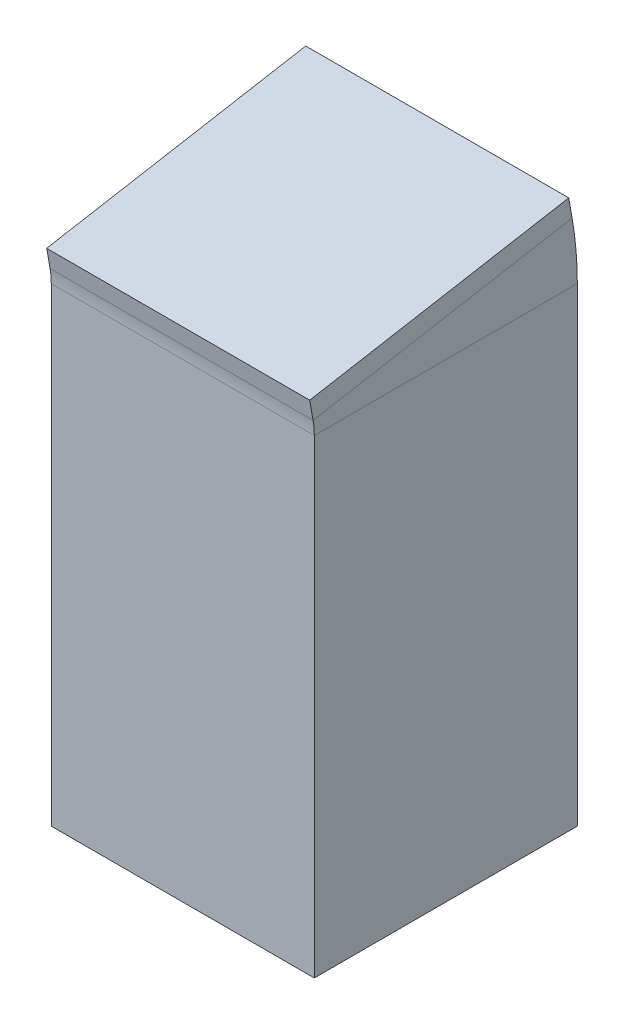
ISO-10303-21;
HEADER;
FILE_DESCRIPTION(('STEP AP214'),'2;1');
FILE_NAME('part.step','',(''),(''),'','','');
FILE_SCHEMA(('AUTOMOTIVE_DESIGN { 1 0 10303 214 1 1 1 1 }'));
ENDSEC;
DATA;
#1=APPLICATION_CONTEXT('core data for automotive mechanical design processes');
#2=APPLICATION_PROTOCOL_DEFINITION('international standard','automotive_design',2000,#1);
#3=PRODUCT_CONTEXT('',#1,'mechanical');
#4=PRODUCT('Part','Part','',(#3));
#5=PRODUCT_RELATED_PRODUCT_CATEGORY('part','',(#4));
#6=PRODUCT_DEFINITION_FORMATION('','',#4);
#7=PRODUCT_DEFINITION_CONTEXT('part definition',#1,'design');
#8=PRODUCT_DEFINITION('design','',#6,#7);
#9=PRODUCT_DEFINITION_SHAPE('','',#8);
#10=(LENGTH_UNIT() NAMED_UNIT(*) SI_UNIT(.MILLI.,.METRE.));
#11=(NAMED_UNIT(*) PLANE_ANGLE_UNIT() SI_UNIT($,.RADIAN.));
#12=(NAMED_UNIT(*) SI_UNIT($,.STERADIAN.) SOLID_ANGLE_UNIT());
#13=UNCERTAINTY_MEASURE_WITH_UNIT(LENGTH_MEASURE(1.E-05),#10,'distance_accuracy_value','');
#14=(GEOMETRIC_REPRESENTATION_CONTEXT(3) GLOBAL_UNCERTAINTY_ASSIGNED_CONTEXT((#13)) GLOBAL_UNIT_ASSIGNED_CONTEXT((#10,
#11,#12)) REPRESENTATION_CONTEXT('',''));
#15=CARTESIAN_POINT('',(0.,0.,0.));
#16=DIRECTION('',(0.,0.,1.));
#17=DIRECTION('',(1.,0.,0.));
#18=AXIS2_PLACEMENT_3D('',#15,#16,#17);
#19=CARTESIAN_POINT('',(0.,-1.48014115800869,-8.37869296850667));
#20=DIRECTION('',(0.,0.173648177666931,-0.984807753012208));
#21=DIRECTION('',(-1.,0.,0.));
#22=AXIS2_PLACEMENT_3D('',#19,#20,#21);
#23=PLANE('',#22);
#24=DIRECTION('',(0.,-0.984807753012208,-0.173648177666931));
#25=VECTOR('',#24,1.);
#26=CARTESIAN_POINT('',(0.,-1.48014115800869,-8.37869296850667));
#27=LINE('',#26,#25);
#28=CARTESIAN_POINT('',(0.,48.5480926950115,0.44263445697341));
#29=VERTEX_POINT('',#28);
#30=CARTESIAN_POINT('',(0.,46.6943234441962,0.11576492204696));
#31=VERTEX_POINT('',#30);
#32=EDGE_CURVE('E59',#29,#31,#27,.T.);
#33=ORIENTED_EDGE('',*,*,#32,.T.);
#34=DIRECTION('',(1.,0.,0.));
#35=VECTOR('',#34,1.);
#36=CARTESIAN_POINT('',(0.,46.6943234441961,0.115764922046945));
#37=LINE('',#36,#35);
#38=CARTESIAN_POINT('',(25.4,46.6943234441962,0.11576492204696));
#39=VERTEX_POINT('',#38);
#40=EDGE_CURVE('E51',#31,#39,#37,.T.);
#41=ORIENTED_EDGE('',*,*,#40,.T.);
#42=DIRECTION('',(0.,0.984807753012208,0.173648177666931));
#43=VECTOR('',#42,1.);
#44=CARTESIAN_POINT('',(25.4,-1.48014115800869,-8.37869296850667));
#45=LINE('',#44,#43);
#46=CARTESIAN_POINT('',(25.4,48.5480926950115,0.44263445697341));
#47=VERTEX_POINT('',#46);
#48=EDGE_CURVE('E67',#39,#47,#45,.T.);
#49=ORIENTED_EDGE('',*,*,#48,.T.);
#50=DIRECTION('',(-1.,0.,0.));
#51=VECTOR('',#50,1.);
#52=CARTESIAN_POINT('',(0.,48.5480926950115,0.44263445697341));
#53=LINE('',#52,#51);
#54=EDGE_CURVE('E169',#47,#29,#53,.T.);
#55=ORIENTED_EDGE('',*,*,#54,.T.);
#56=EDGE_LOOP('',(#33,#41,#49,#55));
#57=FACE_BOUND('',#56,.T.);
#58=ADVANCED_FACE('F42',(#57),#23,.F.);
#59=CARTESIAN_POINT('',(0.,2.93052255473135,-33.3928098950168));
#60=DIRECTION('',(-1.,0.,0.));
#61=DIRECTION('',(0.,-0.173648177666931,0.984807753012208));
#62=AXIS2_PLACEMENT_3D('',#59,#60,#61);
#63=PLANE('',#62);
#64=DIRECTION('',(0.,0.173648177666938,-0.984807753012207));
#65=VECTOR('',#64,1.);
#66=CARTESIAN_POINT('',(0.,51.1049871569363,-24.8983520044628));
#67=LINE('',#66,#65);
#68=CARTESIAN_POINT('',(0.,51.1049871569363,-24.8983520044631));
#69=VERTEX_POINT('',#68);
#70=EDGE_CURVE('E12',#31,#69,#67,.T.);
#71=ORIENTED_EDGE('',*,*,#70,.F.);
#72=ORIENTED_EDGE('',*,*,#32,.F.);
#73=DIRECTION('',(0.,-0.173648177666931,0.984807753012208));
#74=VECTOR('',#73,1.);
#75=CARTESIAN_POINT('',(0.,52.9587564077515,-24.5714824695367));
#76=LINE('',#75,#74);
#77=CARTESIAN_POINT('',(0.,52.9587564077515,-24.5714824695367));
#78=VERTEX_POINT('',#77);
#79=EDGE_CURVE('E172',#78,#29,#76,.T.);
#80=ORIENTED_EDGE('',*,*,#79,.F.);
#81=DIRECTION('',(0.,-0.984807753012208,-0.173648177666931));
#82=VECTOR('',#81,1.);
#83=CARTESIAN_POINT('',(0.,2.93052255473135,-33.3928098950168));
#84=LINE('',#83,#82);
#85=EDGE_CURVE('E171',#78,#69,#84,.T.);
#86=ORIENTED_EDGE('',*,*,#85,.T.);
#87=EDGE_LOOP('',(#71,#72,#80,#86));
#88=FACE_BOUND('',#87,.T.);
#89=ADVANCED_FACE('F44',(#88),#63,.T.);
#90=CARTESIAN_POINT('',(0.,52.9587564077515,-24.5714824695367));
#91=DIRECTION('',(0.,0.984807753012208,0.173648177666931));
#92=DIRECTION('',(0.,-0.173648177666931,0.984807753012208));
#93=AXIS2_PLACEMENT_3D('',#90,#91,#92);
#94=PLANE('',#93);
#95=ORIENTED_EDGE('',*,*,#54,.F.);
#96=DIRECTION('',(0.,-0.173648177666931,0.984807753012208));
#97=VECTOR('',#96,1.);
#98=CARTESIAN_POINT('',(25.4,52.9587564077515,-24.5714824695367));
#99=LINE('',#98,#97);
#100=CARTESIAN_POINT('',(25.4,52.9587564077515,-24.5714824695367));
#101=VERTEX_POINT('',#100);
#102=EDGE_CURVE('E168',#101,#47,#99,.T.);
#103=ORIENTED_EDGE('',*,*,#102,.F.);
#104=DIRECTION('',(-1.,0.,0.));
#105=VECTOR('',#104,1.);
#106=CARTESIAN_POINT('',(0.,52.9587564077515,-24.5714824695367));
#107=LINE('',#106,#105);
#108=EDGE_CURVE('E165',#101,#78,#107,.T.);
#109=ORIENTED_EDGE('',*,*,#108,.T.);
#110=ORIENTED_EDGE('',*,*,#79,.T.);
#111=EDGE_LOOP('',(#95,#103,#109,#110));
#112=FACE_BOUND('',#111,.T.);
#113=ADVANCED_FACE('F217',(#112),#94,.T.);
#114=CARTESIAN_POINT('',(25.4,2.93052255473135,-33.3928098950168));
#115=DIRECTION('',(1.,0.,0.));
#116=DIRECTION('',(0.,0.173648177666931,-0.984807753012208));
#117=AXIS2_PLACEMENT_3D('',#114,#115,#116);
#118=PLANE('',#117);
#119=DIRECTION('',(0.,-0.173648177666938,0.984807753012207));
#120=VECTOR('',#119,1.);
#121=CARTESIAN_POINT('',(25.4,51.1049871569363,-24.8983520044628));
#122=LINE('',#121,#120);
#123=CARTESIAN_POINT('',(25.4,51.1049871569363,-24.8983520044631));
#124=VERTEX_POINT('',#123);
#125=EDGE_CURVE('E177',#124,#39,#122,.T.);
#126=ORIENTED_EDGE('',*,*,#125,.F.);
#127=DIRECTION('',(0.,0.984807753012208,0.173648177666931));
#128=VECTOR('',#127,1.);
#129=CARTESIAN_POINT('',(25.4,2.93052255473135,-33.3928098950168));
#130=LINE('',#129,#128);
#131=EDGE_CURVE('E46',#124,#101,#130,.T.);
#132=ORIENTED_EDGE('',*,*,#131,.T.);
#133=ORIENTED_EDGE('',*,*,#102,.T.);
#134=ORIENTED_EDGE('',*,*,#48,.F.);
#135=EDGE_LOOP('',(#126,#132,#133,#134));
#136=FACE_BOUND('',#135,.T.);
#137=ADVANCED_FACE('F209',(#136),#118,.T.);
#138=CARTESIAN_POINT('',(0.,2.93052255473135,-33.3928098950168));
#139=DIRECTION('',(0.,0.173648177666931,-0.984807753012208));
#140=DIRECTION('',(-1.,0.,0.));
#141=AXIS2_PLACEMENT_3D('',#138,#139,#140);
#142=PLANE('',#141);
#143=DIRECTION('',(1.,0.,0.));
#144=VECTOR('',#143,1.);
#145=CARTESIAN_POINT('',(0.,51.1049871569363,-24.8983520044631));
#146=LINE('',#145,#144);
#147=EDGE_CURVE('E174',#69,#124,#146,.T.);
#148=ORIENTED_EDGE('',*,*,#147,.F.);
#149=ORIENTED_EDGE('',*,*,#85,.F.);
#150=ORIENTED_EDGE('',*,*,#108,.F.);
#151=ORIENTED_EDGE('',*,*,#131,.F.);
#152=EDGE_LOOP('',(#148,#149,#150,#151));
#153=FACE_BOUND('',#152,.T.);
#154=ADVANCED_FACE('F202',(#153),#142,.T.);
#155=CARTESIAN_POINT('',(0.,0.,-25.4));
#156=DIRECTION('',(0.,-1.,0.));
#157=DIRECTION('',(0.,0.,-1.));
#158=AXIS2_PLACEMENT_3D('',#155,#156,#157);
#159=PLANE('',#158);
#160=DIRECTION('',(1.,0.,0.));
#161=VECTOR('',#160,1.);
#162=CARTESIAN_POINT('',(0.,0.,0.));
#163=LINE('',#162,#161);
#164=CARTESIAN_POINT('',(0.,0.,0.));
#165=VERTEX_POINT('',#164);
#166=CARTESIAN_POINT('',(25.4,0.,0.));
#167=VERTEX_POINT('',#166);
#168=EDGE_CURVE('E150',#165,#167,#163,.T.);
#169=ORIENTED_EDGE('',*,*,#168,.F.);
#170=DIRECTION('',(0.,0.,1.));
#171=VECTOR('',#170,1.);
#172=CARTESIAN_POINT('',(0.,0.,-25.4));
#173=LINE('',#172,#171);
#174=CARTESIAN_POINT('',(0.,0.,-25.4));
#175=VERTEX_POINT('',#174);
#176=EDGE_CURVE('E141',#175,#165,#173,.T.);
#177=ORIENTED_EDGE('',*,*,#176,.F.);
#178=DIRECTION('',(1.,0.,0.));
#179=VECTOR('',#178,1.);
#180=CARTESIAN_POINT('',(0.,0.,-25.4));
#181=LINE('',#180,#179);
#182=CARTESIAN_POINT('',(25.4,0.,-25.4));
#183=VERTEX_POINT('',#182);
#184=EDGE_CURVE('E137',#175,#183,#181,.T.);
#185=ORIENTED_EDGE('',*,*,#184,.T.);
#186=DIRECTION('',(0.,0.,1.));
#187=VECTOR('',#186,1.);
#188=CARTESIAN_POINT('',(25.4,0.,-25.4));
#189=LINE('',#188,#187);
#190=EDGE_CURVE('E131',#183,#167,#189,.T.);
#191=ORIENTED_EDGE('',*,*,#190,.T.);
#192=EDGE_LOOP('',(#169,#177,#185,#191));
#193=FACE_BOUND('',#192,.T.);
#194=ADVANCED_FACE('F200',(#193),#159,.T.);
#195=CARTESIAN_POINT('',(0.,0.,-25.4));
#196=DIRECTION('',(0.,0.,-1.));
#197=DIRECTION('',(-1.,0.,0.));
#198=AXIS2_PLACEMENT_3D('',#195,#196,#197);
#199=PLANE('',#198);
#200=DIRECTION('',(0.,-1.,0.));
#201=VECTOR('',#200,1.);
#202=CARTESIAN_POINT('',(0.,0.,-25.4));
#203=LINE('',#202,#201);
#204=CARTESIAN_POINT('',(0.,45.3711243303743,-25.4));
#205=VERTEX_POINT('',#204);
#206=EDGE_CURVE('E134',#205,#175,#203,.T.);
#207=ORIENTED_EDGE('',*,*,#206,.F.);
#208=DIRECTION('',(1.,0.,0.));
#209=VECTOR('',#208,1.);
#210=CARTESIAN_POINT('',(0.,45.3711243303743,-25.4));
#211=LINE('',#210,#209);
#212=CARTESIAN_POINT('',(25.4,45.3711243303743,-25.4));
#213=VERTEX_POINT('',#212);
#214=EDGE_CURVE('E123',#205,#213,#211,.T.);
#215=ORIENTED_EDGE('',*,*,#214,.T.);
#216=DIRECTION('',(0.,1.,0.));
#217=VECTOR('',#216,1.);
#218=CARTESIAN_POINT('',(25.4,0.,-25.4));
#219=LINE('',#218,#217);
#220=EDGE_CURVE('E130',#183,#213,#219,.T.);
#221=ORIENTED_EDGE('',*,*,#220,.F.);
#222=ORIENTED_EDGE('',*,*,#184,.F.);
#223=EDGE_LOOP('',(#207,#215,#221,#222));
#224=FACE_BOUND('',#223,.T.);
#225=ADVANCED_FACE('F135',(#224),#199,.T.);
#226=CARTESIAN_POINT('',(25.4,0.,-25.4));
#227=DIRECTION('',(1.,0.,0.));
#228=DIRECTION('',(0.,0.,-1.));
#229=AXIS2_PLACEMENT_3D('',#226,#227,#228);
#230=PLANE('',#229);
#231=ORIENTED_EDGE('',*,*,#220,.T.);
#232=DIRECTION('',(0.,0.,1.));
#233=VECTOR('',#232,1.);
#234=CARTESIAN_POINT('',(25.4,45.3711243303743,-25.3999999999997));
#235=LINE('',#234,#233);
#236=CARTESIAN_POINT('',(25.4,45.3711243303741,0.));
#237=VERTEX_POINT('',#236);
#238=EDGE_CURVE('E157',#213,#237,#235,.T.);
#239=ORIENTED_EDGE('',*,*,#238,.T.);
#240=DIRECTION('',(0.,1.,0.));
#241=VECTOR('',#240,1.);
#242=CARTESIAN_POINT('',(25.4,0.,0.));
#243=LINE('',#242,#241);
#244=EDGE_CURVE('E147',#167,#237,#243,.T.);
#245=ORIENTED_EDGE('',*,*,#244,.F.);
#246=ORIENTED_EDGE('',*,*,#190,.F.);
#247=EDGE_LOOP('',(#231,#239,#245,#246));
#248=FACE_BOUND('',#247,.T.);
#249=ADVANCED_FACE('F198',(#248),#230,.T.);
#250=CARTESIAN_POINT('',(0.,0.,0.));
#251=DIRECTION('',(0.,0.,-1.));
#252=DIRECTION('',(-1.,0.,0.));
#253=AXIS2_PLACEMENT_3D('',#250,#251,#252);
#254=PLANE('',#253);
#255=DIRECTION('',(1.,0.,0.));
#256=VECTOR('',#255,1.);
#257=CARTESIAN_POINT('',(0.,45.3711243303741,0.));
#258=LINE('',#257,#256);
#259=CARTESIAN_POINT('',(0.,45.3711243303743,0.));
#260=VERTEX_POINT('',#259);
#261=EDGE_CURVE('E163',#260,#237,#258,.T.);
#262=ORIENTED_EDGE('',*,*,#261,.F.);
#263=DIRECTION('',(0.,-1.,0.));
#264=VECTOR('',#263,1.);
#265=CARTESIAN_POINT('',(0.,0.,0.));
#266=LINE('',#265,#264);
#267=EDGE_CURVE('E145',#260,#165,#266,.T.);
#268=ORIENTED_EDGE('',*,*,#267,.T.);
#269=ORIENTED_EDGE('',*,*,#168,.T.);
#270=ORIENTED_EDGE('',*,*,#244,.T.);
#271=EDGE_LOOP('',(#262,#268,#269,#270));
#272=FACE_BOUND('',#271,.T.);
#273=ADVANCED_FACE('F196',(#272),#254,.F.);
#274=CARTESIAN_POINT('',(0.,0.,-25.4));
#275=DIRECTION('',(-1.,0.,0.));
#276=DIRECTION('',(0.,0.,1.));
#277=AXIS2_PLACEMENT_3D('',#274,#275,#276);
#278=PLANE('',#277);
#279=ORIENTED_EDGE('',*,*,#267,.F.);
#280=DIRECTION('',(0.,0.,-1.));
#281=VECTOR('',#280,1.);
#282=CARTESIAN_POINT('',(0.,45.3711243303743,-25.3999999999997));
#283=LINE('',#282,#281);
#284=EDGE_CURVE('E114',#260,#205,#283,.T.);
#285=ORIENTED_EDGE('',*,*,#284,.T.);
#286=ORIENTED_EDGE('',*,*,#206,.T.);
#287=ORIENTED_EDGE('',*,*,#176,.T.);
#288=EDGE_LOOP('',(#279,#285,#286,#287));
#289=FACE_BOUND('',#288,.T.);
#290=ADVANCED_FACE('F144',(#289),#278,.T.);
#291=CARTESIAN_POINT('',(0.,45.3711243303743,7.62));
#292=DIRECTION('',(-1.,0.,0.));
#293=DIRECTION('',(0.,0.,1.));
#294=AXIS2_PLACEMENT_3D('',#291,#292,#293);
#295=PLANE('',#294);
#296=ORIENTED_EDGE('',*,*,#284,.F.);
#297=CARTESIAN_POINT('',(0.,45.3711243303743,7.62));
#298=DIRECTION('',(1.,0.,0.));
#299=DIRECTION('',(0.,0.,-1.));
#300=AXIS2_PLACEMENT_3D('',#297,#298,#299);
#301=CIRCLE('',#300,7.62);
#302=EDGE_CURVE('E185',#260,#31,#301,.T.);
#303=ORIENTED_EDGE('',*,*,#302,.T.);
#304=ORIENTED_EDGE('',*,*,#70,.T.);
#305=CARTESIAN_POINT('',(0.,45.3711243303743,7.62));
#306=DIRECTION('',(1.,0.,0.));
#307=DIRECTION('',(0.,0.,1.));
#308=AXIS2_PLACEMENT_3D('',#305,#306,#307);
#309=CIRCLE('',#308,33.02);
#310=EDGE_CURVE('E109',#205,#69,#309,.T.);
#311=ORIENTED_EDGE('',*,*,#310,.F.);
#312=EDGE_LOOP('',(#296,#303,#304,#311));
#313=FACE_BOUND('',#312,.T.);
#314=ADVANCED_FACE('F111',(#313),#295,.T.);
#315=CARTESIAN_POINT('',(25.4,45.3711243303743,7.62));
#316=DIRECTION('',(1.,0.,0.));
#317=DIRECTION('',(0.,0.,-1.));
#318=AXIS2_PLACEMENT_3D('',#315,#316,#317);
#319=PLANE('',#318);
#320=ORIENTED_EDGE('',*,*,#125,.T.);
#321=CARTESIAN_POINT('',(25.4,45.3711243303743,7.62));
#322=DIRECTION('',(1.,0.,0.));
#323=DIRECTION('',(0.,0.,-1.));
#324=AXIS2_PLACEMENT_3D('',#321,#322,#323);
#325=CIRCLE('',#324,7.62);
#326=EDGE_CURVE('E119',#39,#237,#325,.F.);
#327=ORIENTED_EDGE('',*,*,#326,.T.);
#328=ORIENTED_EDGE('',*,*,#238,.F.);
#329=CARTESIAN_POINT('',(25.4,45.3711243303743,7.62));
#330=DIRECTION('',(-1.,0.,0.));
#331=DIRECTION('',(0.,0.,-1.));
#332=AXIS2_PLACEMENT_3D('',#329,#330,#331);
#333=CIRCLE('',#332,33.02);
#334=EDGE_CURVE('E118',#124,#213,#333,.T.);
#335=ORIENTED_EDGE('',*,*,#334,.F.);
#336=EDGE_LOOP('',(#320,#327,#328,#335));
#337=FACE_BOUND('',#336,.T.);
#338=ADVANCED_FACE('F191',(#337),#319,.T.);
#339=CARTESIAN_POINT('',(-23.3956746213611,45.3711243303743,7.62));
#340=DIRECTION('',(1.,0.,0.));
#341=DIRECTION('',(0.,0.,-1.));
#342=AXIS2_PLACEMENT_3D('',#339,#340,#341);
#343=CYLINDRICAL_SURFACE('',#342,33.02);
#344=ORIENTED_EDGE('',*,*,#334,.T.);
#345=ORIENTED_EDGE('',*,*,#214,.F.);
#346=ORIENTED_EDGE('',*,*,#310,.T.);
#347=ORIENTED_EDGE('',*,*,#147,.T.);
#348=EDGE_LOOP('',(#344,#345,#346,#347));
#349=FACE_BOUND('',#348,.T.);
#350=ADVANCED_FACE('F125',(#349),#343,.T.);
#351=CARTESIAN_POINT('',(-23.3956746213611,45.3711243303743,7.62));
#352=DIRECTION('',(1.,0.,0.));
#353=DIRECTION('',(0.,0.,-1.));
#354=AXIS2_PLACEMENT_3D('',#351,#352,#353);
#355=CYLINDRICAL_SURFACE('',#354,7.62);
#356=ORIENTED_EDGE('',*,*,#326,.F.);
#357=ORIENTED_EDGE('',*,*,#40,.F.);
#358=ORIENTED_EDGE('',*,*,#302,.F.);
#359=ORIENTED_EDGE('',*,*,#261,.T.);
#360=EDGE_LOOP('',(#356,#357,#358,#359));
#361=FACE_BOUND('',#360,.T.);
#362=ADVANCED_FACE('F259',(#361),#355,.F.);
#363=CLOSED_SHELL('',(#58,#89,#113,#137,#154,#194,#225,#249,#273,#290,#314,#338,#350,#362));
#364=MANIFOLD_SOLID_BREP('B2',#363);
#365=ADVANCED_BREP_SHAPE_REPRESENTATION('',(#18,#364),#14);
#366=SHAPE_DEFINITION_REPRESENTATION(#9,#365);
ENDSEC;
END-ISO-10303-21;
